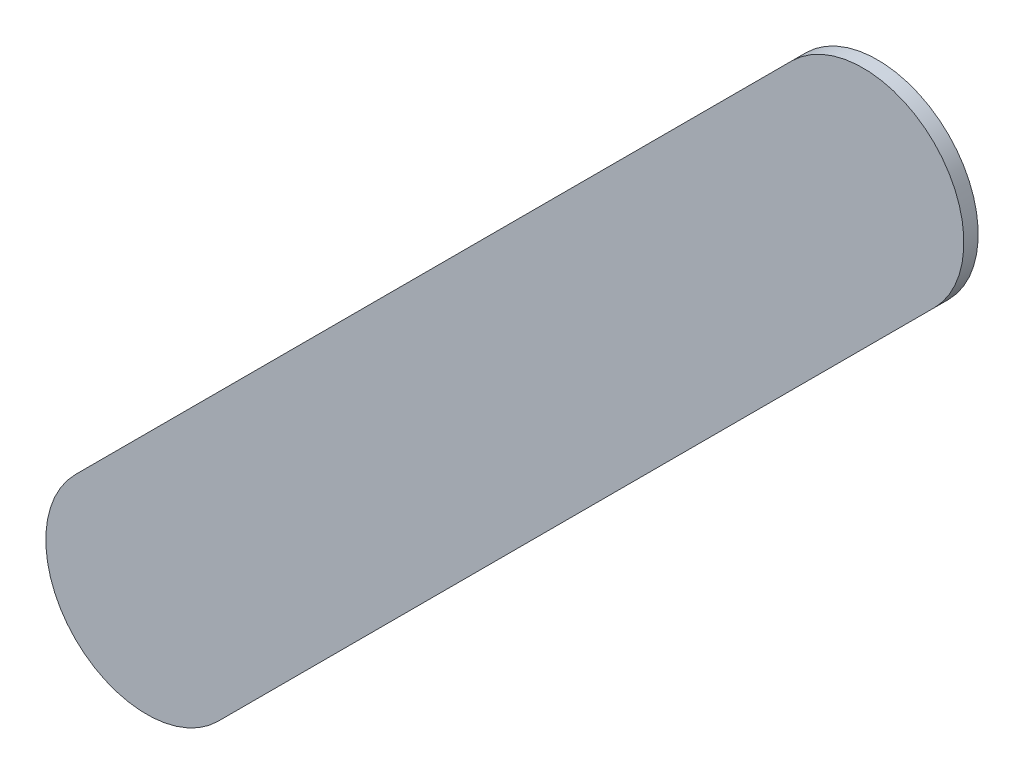
ISO-10303-21;
HEADER;
FILE_DESCRIPTION(('STEP AP214'),'2;1');
FILE_NAME('part.step','',(''),(''),'','','');
FILE_SCHEMA(('AUTOMOTIVE_DESIGN { 1 0 10303 214 1 1 1 1 }'));
ENDSEC;
DATA;
#1=APPLICATION_CONTEXT('core data for automotive mechanical design processes');
#2=APPLICATION_PROTOCOL_DEFINITION('international standard','automotive_design',2000,#1);
#3=PRODUCT_CONTEXT('',#1,'mechanical');
#4=PRODUCT('Part','Part','',(#3));
#5=PRODUCT_RELATED_PRODUCT_CATEGORY('part','',(#4));
#6=PRODUCT_DEFINITION_FORMATION('','',#4);
#7=PRODUCT_DEFINITION_CONTEXT('part definition',#1,'design');
#8=PRODUCT_DEFINITION('design','',#6,#7);
#9=PRODUCT_DEFINITION_SHAPE('','',#8);
#10=(LENGTH_UNIT() NAMED_UNIT(*) SI_UNIT(.MILLI.,.METRE.));
#11=(NAMED_UNIT(*) PLANE_ANGLE_UNIT() SI_UNIT($,.RADIAN.));
#12=(NAMED_UNIT(*) SI_UNIT($,.STERADIAN.) SOLID_ANGLE_UNIT());
#13=UNCERTAINTY_MEASURE_WITH_UNIT(LENGTH_MEASURE(1.E-05),#10,'distance_accuracy_value','');
#14=(GEOMETRIC_REPRESENTATION_CONTEXT(3) GLOBAL_UNCERTAINTY_ASSIGNED_CONTEXT((#13)) GLOBAL_UNIT_ASSIGNED_CONTEXT((#10,
#11,#12)) REPRESENTATION_CONTEXT('',''));
#15=CARTESIAN_POINT('',(0.,0.,0.));
#16=DIRECTION('',(0.,0.,1.));
#17=DIRECTION('',(1.,0.,0.));
#18=AXIS2_PLACEMENT_3D('',#15,#16,#17);
#19=CARTESIAN_POINT('',(86.07677476,92.82322304,0.));
#20=DIRECTION('',(-0.707106781186548,0.707106781186548,0.));
#21=DIRECTION('',(0.707106781186548,0.707106781186548,0.));
#22=AXIS2_PLACEMENT_3D('',#19,#20,#21);
#23=PLANE('',#22);
#24=DIRECTION('',(0.707106781186548,0.707106781186548,0.));
#25=VECTOR('',#24,1.);
#26=CARTESIAN_POINT('',(86.07677476,92.82322304,0.03556));
#27=LINE('',#26,#25);
#28=CARTESIAN_POINT('',(86.07677476,92.82322304,0.03556));
#29=VERTEX_POINT('',#28);
#30=CARTESIAN_POINT('',(87.8541423,94.60059058,0.03556));
#31=VERTEX_POINT('',#30);
#32=EDGE_CURVE('E11',#29,#31,#27,.T.);
#33=ORIENTED_EDGE('',*,*,#32,.F.);
#34=DIRECTION('',(0.,0.,1.));
#35=VECTOR('',#34,1.);
#36=CARTESIAN_POINT('',(86.07677476,92.82322304,0.));
#37=LINE('',#36,#35);
#38=CARTESIAN_POINT('',(86.07677476,92.82322304,0.));
#39=VERTEX_POINT('',#38);
#40=EDGE_CURVE('E24',#39,#29,#37,.T.);
#41=ORIENTED_EDGE('',*,*,#40,.F.);
#42=DIRECTION('',(0.707106781186548,0.707106781186548,0.));
#43=VECTOR('',#42,1.);
#44=CARTESIAN_POINT('',(86.07677476,92.82322304,0.));
#45=LINE('',#44,#43);
#46=CARTESIAN_POINT('',(87.8541423,94.60059058,0.));
#47=VERTEX_POINT('',#46);
#48=EDGE_CURVE('E75',#39,#47,#45,.T.);
#49=ORIENTED_EDGE('',*,*,#48,.T.);
#50=DIRECTION('',(0.,0.,1.));
#51=VECTOR('',#50,1.);
#52=CARTESIAN_POINT('',(87.8541423,94.60059058,0.));
#53=LINE('',#52,#51);
#54=EDGE_CURVE('E37',#47,#31,#53,.T.);
#55=ORIENTED_EDGE('',*,*,#54,.T.);
#56=EDGE_LOOP('',(#33,#41,#49,#55));
#57=FACE_BOUND('',#56,.T.);
#58=ADVANCED_FACE('F17',(#57),#23,.F.);
#59=CARTESIAN_POINT('',(87.67736592,94.77736696,0.));
#60=DIRECTION('',(0.,0.,-1.));
#61=DIRECTION('',(0.707106781186519,-0.707106781186576,0.));
#62=AXIS2_PLACEMENT_3D('',#59,#60,#61);
#63=CYLINDRICAL_SURFACE('',#62,0.249999554103223);
#64=CARTESIAN_POINT('',(87.67736592,94.77736696,0.03556));
#65=DIRECTION('',(0.,0.,1.));
#66=DIRECTION('',(0.707106781186519,-0.707106781186576,0.));
#67=AXIS2_PLACEMENT_3D('',#64,#65,#66);
#68=CIRCLE('',#67,0.249999554103223);
#69=CARTESIAN_POINT('',(87.50058954,94.95414334,0.03556));
#70=VERTEX_POINT('',#69);
#71=EDGE_CURVE('E83',#31,#70,#68,.T.);
#72=ORIENTED_EDGE('',*,*,#71,.F.);
#73=ORIENTED_EDGE('',*,*,#54,.F.);
#74=CARTESIAN_POINT('',(87.67736592,94.77736696,0.));
#75=DIRECTION('',(0.,0.,1.));
#76=DIRECTION('',(0.707106781186519,-0.707106781186576,0.));
#77=AXIS2_PLACEMENT_3D('',#74,#75,#76);
#78=CIRCLE('',#77,0.249999554103223);
#79=CARTESIAN_POINT('',(87.50058954,94.95414334,0.));
#80=VERTEX_POINT('',#79);
#81=EDGE_CURVE('E81',#47,#80,#78,.T.);
#82=ORIENTED_EDGE('',*,*,#81,.T.);
#83=DIRECTION('',(0.,0.,1.));
#84=VECTOR('',#83,1.);
#85=CARTESIAN_POINT('',(87.50058954,94.95414334,0.));
#86=LINE('',#85,#84);
#87=EDGE_CURVE('E67',#80,#70,#86,.T.);
#88=ORIENTED_EDGE('',*,*,#87,.T.);
#89=EDGE_LOOP('',(#72,#73,#82,#88));
#90=FACE_BOUND('',#89,.T.);
#91=ADVANCED_FACE('F89',(#90),#63,.T.);
#92=CARTESIAN_POINT('',(87.50058954,94.95414334,0.));
#93=DIRECTION('',(0.70710678118655,-0.707106781186545,0.));
#94=DIRECTION('',(-0.707106781186545,-0.70710678118655,0.));
#95=AXIS2_PLACEMENT_3D('',#92,#93,#94);
#96=PLANE('',#95);
#97=DIRECTION('',(-0.707106781186545,-0.70710678118655,0.));
#98=VECTOR('',#97,1.);
#99=CARTESIAN_POINT('',(87.50058954,94.95414334,0.03556));
#100=LINE('',#99,#98);
#101=CARTESIAN_POINT('',(85.723222,93.1767758,0.03556));
#102=VERTEX_POINT('',#101);
#103=EDGE_CURVE('E71',#70,#102,#100,.T.);
#104=ORIENTED_EDGE('',*,*,#103,.F.);
#105=ORIENTED_EDGE('',*,*,#87,.F.);
#106=DIRECTION('',(-0.707106781186545,-0.70710678118655,0.));
#107=VECTOR('',#106,1.);
#108=CARTESIAN_POINT('',(87.50058954,94.95414334,0.));
#109=LINE('',#108,#107);
#110=CARTESIAN_POINT('',(85.723222,93.1767758,0.));
#111=VERTEX_POINT('',#110);
#112=EDGE_CURVE('E63',#80,#111,#109,.T.);
#113=ORIENTED_EDGE('',*,*,#112,.T.);
#114=DIRECTION('',(0.,0.,1.));
#115=VECTOR('',#114,1.);
#116=CARTESIAN_POINT('',(85.723222,93.1767758,0.));
#117=LINE('',#116,#115);
#118=EDGE_CURVE('E53',#111,#102,#117,.T.);
#119=ORIENTED_EDGE('',*,*,#118,.T.);
#120=EDGE_LOOP('',(#104,#105,#113,#119));
#121=FACE_BOUND('',#120,.T.);
#122=ADVANCED_FACE('F66',(#121),#96,.F.);
#123=CARTESIAN_POINT('',(85.89999838,92.99999942,0.));
#124=DIRECTION('',(0.,0.,-1.));
#125=DIRECTION('',(-0.707106781186576,0.707106781186519,0.));
#126=AXIS2_PLACEMENT_3D('',#123,#124,#125);
#127=CYLINDRICAL_SURFACE('',#126,0.24999955410322);
#128=CARTESIAN_POINT('',(85.89999838,92.99999942,0.03556));
#129=DIRECTION('',(0.,0.,1.));
#130=DIRECTION('',(-0.707106781186576,0.707106781186519,0.));
#131=AXIS2_PLACEMENT_3D('',#128,#129,#130);
#132=CIRCLE('',#131,0.24999955410322);
#133=EDGE_CURVE('E59',#102,#29,#132,.T.);
#134=ORIENTED_EDGE('',*,*,#133,.F.);
#135=ORIENTED_EDGE('',*,*,#118,.F.);
#136=CARTESIAN_POINT('',(85.89999838,92.99999942,0.));
#137=DIRECTION('',(0.,0.,1.));
#138=DIRECTION('',(-0.707106781186576,0.707106781186519,0.));
#139=AXIS2_PLACEMENT_3D('',#136,#137,#138);
#140=CIRCLE('',#139,0.24999955410322);
#141=EDGE_CURVE('E57',#111,#39,#140,.T.);
#142=ORIENTED_EDGE('',*,*,#141,.T.);
#143=ORIENTED_EDGE('',*,*,#40,.T.);
#144=EDGE_LOOP('',(#134,#135,#142,#143));
#145=FACE_BOUND('',#144,.T.);
#146=ADVANCED_FACE('F55',(#145),#127,.T.);
#147=CARTESIAN_POINT('',(86.07677476,92.82322304,0.));
#148=DIRECTION('',(0.,0.,-1.));
#149=DIRECTION('',(-1.,0.,0.));
#150=AXIS2_PLACEMENT_3D('',#147,#148,#149);
#151=PLANE('',#150);
#152=ORIENTED_EDGE('',*,*,#141,.F.);
#153=ORIENTED_EDGE('',*,*,#112,.F.);
#154=ORIENTED_EDGE('',*,*,#81,.F.);
#155=ORIENTED_EDGE('',*,*,#48,.F.);
#156=EDGE_LOOP('',(#152,#153,#154,#155));
#157=FACE_BOUND('',#156,.T.);
#158=ADVANCED_FACE('F74',(#157),#151,.T.);
#159=CARTESIAN_POINT('',(86.07677476,92.82322304,0.03556));
#160=DIRECTION('',(0.,0.,-1.));
#161=DIRECTION('',(-1.,0.,0.));
#162=AXIS2_PLACEMENT_3D('',#159,#160,#161);
#163=PLANE('',#162);
#164=ORIENTED_EDGE('',*,*,#32,.T.);
#165=ORIENTED_EDGE('',*,*,#71,.T.);
#166=ORIENTED_EDGE('',*,*,#103,.T.);
#167=ORIENTED_EDGE('',*,*,#133,.T.);
#168=EDGE_LOOP('',(#164,#165,#166,#167));
#169=FACE_BOUND('',#168,.T.);
#170=ADVANCED_FACE('F91',(#169),#163,.F.);
#171=CLOSED_SHELL('',(#58,#91,#122,#146,#158,#170));
#172=MANIFOLD_SOLID_BREP('B1',#171);
#173=ADVANCED_BREP_SHAPE_REPRESENTATION('',(#18,#172),#14);
#174=SHAPE_DEFINITION_REPRESENTATION(#9,#173);
ENDSEC;
END-ISO-10303-21;
